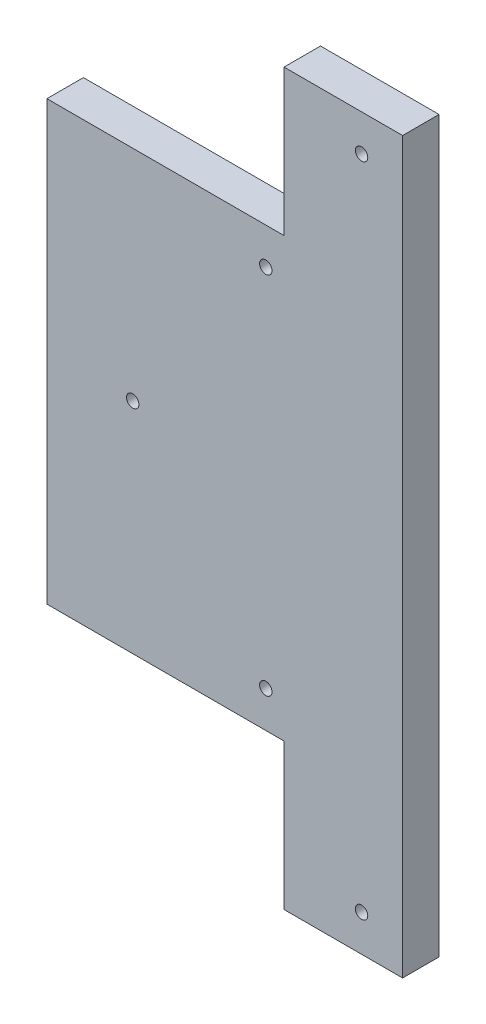
ISO-10303-21;
HEADER;
FILE_DESCRIPTION(('STEP AP214'),'2;1');
FILE_NAME('part.step','',(''),(''),'','','');
FILE_SCHEMA(('AUTOMOTIVE_DESIGN { 1 0 10303 214 1 1 1 1 }'));
ENDSEC;
DATA;
#1=APPLICATION_CONTEXT('core data for automotive mechanical design processes');
#2=APPLICATION_PROTOCOL_DEFINITION('international standard','automotive_design',2000,#1);
#3=PRODUCT_CONTEXT('',#1,'mechanical');
#4=PRODUCT('Part','Part','',(#3));
#5=PRODUCT_RELATED_PRODUCT_CATEGORY('part','',(#4));
#6=PRODUCT_DEFINITION_FORMATION('','',#4);
#7=PRODUCT_DEFINITION_CONTEXT('part definition',#1,'design');
#8=PRODUCT_DEFINITION('design','',#6,#7);
#9=PRODUCT_DEFINITION_SHAPE('','',#8);
#10=(LENGTH_UNIT() NAMED_UNIT(*) SI_UNIT(.MILLI.,.METRE.));
#11=(NAMED_UNIT(*) PLANE_ANGLE_UNIT() SI_UNIT($,.RADIAN.));
#12=(NAMED_UNIT(*) SI_UNIT($,.STERADIAN.) SOLID_ANGLE_UNIT());
#13=UNCERTAINTY_MEASURE_WITH_UNIT(LENGTH_MEASURE(1.E-05),#10,'distance_accuracy_value','');
#14=(GEOMETRIC_REPRESENTATION_CONTEXT(3) GLOBAL_UNCERTAINTY_ASSIGNED_CONTEXT((#13)) GLOBAL_UNIT_ASSIGNED_CONTEXT((#10,
#11,#12)) REPRESENTATION_CONTEXT('',''));
#15=CARTESIAN_POINT('',(0.,0.,0.));
#16=DIRECTION('',(0.,0.,1.));
#17=DIRECTION('',(1.,0.,0.));
#18=AXIS2_PLACEMENT_3D('',#15,#16,#17);
#19=CARTESIAN_POINT('',(0.,0.,10.));
#20=DIRECTION('',(0.,0.,-1.));
#21=DIRECTION('',(-1.,0.,0.));
#22=AXIS2_PLACEMENT_3D('',#19,#20,#21);
#23=PLANE('',#22);
#24=CARTESIAN_POINT('',(-62.74,0.,10.));
#25=DIRECTION('',(0.,0.,-1.));
#26=DIRECTION('',(-1.,0.,0.));
#27=AXIS2_PLACEMENT_3D('',#24,#25,#26);
#28=CIRCLE('',#27,1.7);
#29=CARTESIAN_POINT('',(-64.44,0.,10.));
#30=VERTEX_POINT('',#29);
#31=EDGE_CURVE('E277',#30,#30,#28,.T.);
#32=ORIENTED_EDGE('',*,*,#31,.T.);
#33=EDGE_LOOP('',(#32));
#34=FACE_BOUND('',#33,.T.);
#35=CARTESIAN_POINT('',(-26.25,-50.,10.));
#36=DIRECTION('',(0.,0.,-1.));
#37=DIRECTION('',(-1.,0.,0.));
#38=AXIS2_PLACEMENT_3D('',#35,#36,#37);
#39=CIRCLE('',#38,1.7);
#40=CARTESIAN_POINT('',(-27.95,-50.,10.));
#41=VERTEX_POINT('',#40);
#42=EDGE_CURVE('E188',#41,#41,#39,.T.);
#43=ORIENTED_EDGE('',*,*,#42,.T.);
#44=EDGE_LOOP('',(#43));
#45=FACE_BOUND('',#44,.T.);
#46=CARTESIAN_POINT('',(-26.25,50.,10.));
#47=DIRECTION('',(0.,0.,-1.));
#48=DIRECTION('',(-1.,0.,0.));
#49=AXIS2_PLACEMENT_3D('',#46,#47,#48);
#50=CIRCLE('',#49,1.7);
#51=CARTESIAN_POINT('',(-27.95,50.,10.));
#52=VERTEX_POINT('',#51);
#53=EDGE_CURVE('E194',#52,#52,#50,.T.);
#54=ORIENTED_EDGE('',*,*,#53,.T.);
#55=EDGE_LOOP('',(#54));
#56=FACE_BOUND('',#55,.T.);
#57=DIRECTION('',(-1.,0.,0.));
#58=VECTOR('',#57,1.);
#59=CARTESIAN_POINT('',(-21.25,-60.,10.));
#60=LINE('',#59,#58);
#61=CARTESIAN_POINT('',(-21.25,-60.,9.99999999999999));
#62=VERTEX_POINT('',#61);
#63=CARTESIAN_POINT('',(-86.25,-60.,10.));
#64=VERTEX_POINT('',#63);
#65=EDGE_CURVE('E131',#62,#64,#60,.T.);
#66=ORIENTED_EDGE('',*,*,#65,.F.);
#67=DIRECTION('',(0.,-1.,0.));
#68=VECTOR('',#67,1.);
#69=CARTESIAN_POINT('',(-21.25,-100.,10.));
#70=LINE('',#69,#68);
#71=CARTESIAN_POINT('',(-21.25,-100.,10.));
#72=VERTEX_POINT('',#71);
#73=EDGE_CURVE('E70',#62,#72,#70,.T.);
#74=ORIENTED_EDGE('',*,*,#73,.T.);
#75=DIRECTION('',(1.,0.,0.));
#76=VECTOR('',#75,1.);
#77=CARTESIAN_POINT('',(11.25,-100.,10.));
#78=LINE('',#77,#76);
#79=CARTESIAN_POINT('',(11.25,-100.,10.));
#80=VERTEX_POINT('',#79);
#81=EDGE_CURVE('E172',#72,#80,#78,.T.);
#82=ORIENTED_EDGE('',*,*,#81,.T.);
#83=DIRECTION('',(0.,1.,0.));
#84=VECTOR('',#83,1.);
#85=CARTESIAN_POINT('',(11.25,100.,10.));
#86=LINE('',#85,#84);
#87=CARTESIAN_POINT('',(11.25,100.,10.));
#88=VERTEX_POINT('',#87);
#89=EDGE_CURVE('E99',#80,#88,#86,.T.);
#90=ORIENTED_EDGE('',*,*,#89,.T.);
#91=DIRECTION('',(-1.,0.,0.));
#92=VECTOR('',#91,1.);
#93=CARTESIAN_POINT('',(11.25,100.,10.));
#94=LINE('',#93,#92);
#95=CARTESIAN_POINT('',(-21.25,100.,10.));
#96=VERTEX_POINT('',#95);
#97=EDGE_CURVE('E148',#88,#96,#94,.T.);
#98=ORIENTED_EDGE('',*,*,#97,.T.);
#99=CARTESIAN_POINT('',(-21.25,60.,9.99999999999999));
#100=VERTEX_POINT('',#99);
#101=EDGE_CURVE('E139',#96,#100,#70,.T.);
#102=ORIENTED_EDGE('',*,*,#101,.T.);
#103=DIRECTION('',(1.,0.,0.));
#104=VECTOR('',#103,1.);
#105=CARTESIAN_POINT('',(-21.25,60.,10.));
#106=LINE('',#105,#104);
#107=CARTESIAN_POINT('',(-86.25,60.,10.));
#108=VERTEX_POINT('',#107);
#109=EDGE_CURVE('E120',#108,#100,#106,.T.);
#110=ORIENTED_EDGE('',*,*,#109,.F.);
#111=DIRECTION('',(0.,1.,0.));
#112=VECTOR('',#111,1.);
#113=CARTESIAN_POINT('',(-86.25,-60.,10.));
#114=LINE('',#113,#112);
#115=EDGE_CURVE('E144',#64,#108,#114,.T.);
#116=ORIENTED_EDGE('',*,*,#115,.F.);
#117=EDGE_LOOP('',(#66,#74,#82,#90,#98,#102,#110,#116));
#118=FACE_BOUND('',#117,.T.);
#119=CARTESIAN_POINT('',(0.,-90.,10.));
#120=DIRECTION('',(0.,0.,1.));
#121=DIRECTION('',(1.,0.,0.));
#122=AXIS2_PLACEMENT_3D('',#119,#120,#121);
#123=CIRCLE('',#122,1.7);
#124=CARTESIAN_POINT('',(1.70000000000002,-90.,10.));
#125=VERTEX_POINT('',#124);
#126=EDGE_CURVE('E232',#125,#125,#123,.T.);
#127=ORIENTED_EDGE('',*,*,#126,.F.);
#128=EDGE_LOOP('',(#127));
#129=FACE_BOUND('',#128,.T.);
#130=CARTESIAN_POINT('',(0.,90.,10.));
#131=DIRECTION('',(0.,0.,1.));
#132=DIRECTION('',(1.,0.,0.));
#133=AXIS2_PLACEMENT_3D('',#130,#131,#132);
#134=CIRCLE('',#133,1.7);
#135=CARTESIAN_POINT('',(1.69999999999997,90.,10.));
#136=VERTEX_POINT('',#135);
#137=EDGE_CURVE('E165',#136,#136,#134,.T.);
#138=ORIENTED_EDGE('',*,*,#137,.F.);
#139=EDGE_LOOP('',(#138));
#140=FACE_BOUND('',#139,.T.);
#141=ADVANCED_FACE('F45',(#34,#45,#56,#118,#129,#140),#23,.F.);
#142=CARTESIAN_POINT('',(-21.25,-100.,10.));
#143=DIRECTION('',(1.,0.,0.));
#144=DIRECTION('',(0.,1.,0.));
#145=AXIS2_PLACEMENT_3D('',#142,#143,#144);
#146=PLANE('',#145);
#147=DIRECTION('',(0.,0.,-1.));
#148=VECTOR('',#147,1.);
#149=CARTESIAN_POINT('',(-21.25,60.,10.));
#150=LINE('',#149,#148);
#151=CARTESIAN_POINT('',(-21.25,60.,0.));
#152=VERTEX_POINT('',#151);
#153=EDGE_CURVE('E124',#100,#152,#150,.T.);
#154=ORIENTED_EDGE('',*,*,#153,.F.);
#155=ORIENTED_EDGE('',*,*,#101,.F.);
#156=DIRECTION('',(0.,0.,-1.));
#157=VECTOR('',#156,1.);
#158=CARTESIAN_POINT('',(-21.25,100.,10.));
#159=LINE('',#158,#157);
#160=CARTESIAN_POINT('',(-21.25,100.,0.));
#161=VERTEX_POINT('',#160);
#162=EDGE_CURVE('E155',#96,#161,#159,.T.);
#163=ORIENTED_EDGE('',*,*,#162,.T.);
#164=DIRECTION('',(0.,-1.,0.));
#165=VECTOR('',#164,1.);
#166=CARTESIAN_POINT('',(-21.25,-100.,0.));
#167=LINE('',#166,#165);
#168=EDGE_CURVE('E141',#161,#152,#167,.T.);
#169=ORIENTED_EDGE('',*,*,#168,.T.);
#170=EDGE_LOOP('',(#154,#155,#163,#169));
#171=FACE_BOUND('',#170,.T.);
#172=ADVANCED_FACE('F137',(#171),#146,.F.);
#173=CARTESIAN_POINT('',(11.25,100.,10.));
#174=DIRECTION('',(-1.,0.,0.));
#175=DIRECTION('',(0.,-1.,0.));
#176=AXIS2_PLACEMENT_3D('',#173,#174,#175);
#177=PLANE('',#176);
#178=DIRECTION('',(0.,1.,0.));
#179=VECTOR('',#178,1.);
#180=CARTESIAN_POINT('',(11.25,100.,0.));
#181=LINE('',#180,#179);
#182=CARTESIAN_POINT('',(11.25,-100.,0.));
#183=VERTEX_POINT('',#182);
#184=CARTESIAN_POINT('',(11.25,100.,0.));
#185=VERTEX_POINT('',#184);
#186=EDGE_CURVE('E160',#183,#185,#181,.T.);
#187=ORIENTED_EDGE('',*,*,#186,.T.);
#188=DIRECTION('',(0.,0.,-1.));
#189=VECTOR('',#188,1.);
#190=CARTESIAN_POINT('',(11.25,100.,10.));
#191=LINE('',#190,#189);
#192=EDGE_CURVE('E54',#88,#185,#191,.T.);
#193=ORIENTED_EDGE('',*,*,#192,.F.);
#194=ORIENTED_EDGE('',*,*,#89,.F.);
#195=DIRECTION('',(0.,0.,-1.));
#196=VECTOR('',#195,1.);
#197=CARTESIAN_POINT('',(11.25,-100.,10.));
#198=LINE('',#197,#196);
#199=EDGE_CURVE('E11',#80,#183,#198,.T.);
#200=ORIENTED_EDGE('',*,*,#199,.T.);
#201=EDGE_LOOP('',(#187,#193,#194,#200));
#202=FACE_BOUND('',#201,.T.);
#203=ADVANCED_FACE('F47',(#202),#177,.F.);
#204=CARTESIAN_POINT('',(-11.25,100.,10.));
#205=DIRECTION('',(0.,-1.,0.));
#206=DIRECTION('',(1.,0.,0.));
#207=AXIS2_PLACEMENT_3D('',#204,#205,#206);
#208=PLANE('',#207);
#209=DIRECTION('',(-1.,0.,0.));
#210=VECTOR('',#209,1.);
#211=CARTESIAN_POINT('',(-11.25,100.,0.));
#212=LINE('',#211,#210);
#213=EDGE_CURVE('E164',#185,#161,#212,.T.);
#214=ORIENTED_EDGE('',*,*,#213,.T.);
#215=ORIENTED_EDGE('',*,*,#162,.F.);
#216=ORIENTED_EDGE('',*,*,#97,.F.);
#217=ORIENTED_EDGE('',*,*,#192,.T.);
#218=EDGE_LOOP('',(#214,#215,#216,#217));
#219=FACE_BOUND('',#218,.T.);
#220=ADVANCED_FACE('F178',(#219),#208,.F.);
#221=ORIENTED_EDGE('',*,*,#73,.F.);
#222=DIRECTION('',(0.,0.,-1.));
#223=VECTOR('',#222,1.);
#224=CARTESIAN_POINT('',(-21.25,-60.,10.));
#225=LINE('',#224,#223);
#226=CARTESIAN_POINT('',(-21.25,-60.,0.));
#227=VERTEX_POINT('',#226);
#228=EDGE_CURVE('E143',#62,#227,#225,.T.);
#229=ORIENTED_EDGE('',*,*,#228,.T.);
#230=CARTESIAN_POINT('',(-21.25,-100.,0.));
#231=VERTEX_POINT('',#230);
#232=EDGE_CURVE('E92',#227,#231,#167,.T.);
#233=ORIENTED_EDGE('',*,*,#232,.T.);
#234=DIRECTION('',(0.,0.,-1.));
#235=VECTOR('',#234,1.);
#236=CARTESIAN_POINT('',(-21.25,-100.,10.));
#237=LINE('',#236,#235);
#238=EDGE_CURVE('E151',#72,#231,#237,.T.);
#239=ORIENTED_EDGE('',*,*,#238,.F.);
#240=EDGE_LOOP('',(#221,#229,#233,#239));
#241=FACE_BOUND('',#240,.T.);
#242=ADVANCED_FACE('F244',(#241),#146,.F.);
#243=CARTESIAN_POINT('',(-11.25,-100.,10.));
#244=DIRECTION('',(0.,1.,0.));
#245=DIRECTION('',(-1.,0.,0.));
#246=AXIS2_PLACEMENT_3D('',#243,#244,#245);
#247=PLANE('',#246);
#248=DIRECTION('',(1.,0.,0.));
#249=VECTOR('',#248,1.);
#250=CARTESIAN_POINT('',(-11.25,-100.,0.));
#251=LINE('',#250,#249);
#252=EDGE_CURVE('E170',#231,#183,#251,.T.);
#253=ORIENTED_EDGE('',*,*,#252,.T.);
#254=ORIENTED_EDGE('',*,*,#199,.F.);
#255=ORIENTED_EDGE('',*,*,#81,.F.);
#256=ORIENTED_EDGE('',*,*,#238,.T.);
#257=EDGE_LOOP('',(#253,#254,#255,#256));
#258=FACE_BOUND('',#257,.T.);
#259=ADVANCED_FACE('F243',(#258),#247,.F.);
#260=CARTESIAN_POINT('',(0.,0.,0.));
#261=DIRECTION('',(0.,0.,-1.));
#262=DIRECTION('',(-1.,0.,0.));
#263=AXIS2_PLACEMENT_3D('',#260,#261,#262);
#264=PLANE('',#263);
#265=CARTESIAN_POINT('',(-62.74,0.,0.));
#266=DIRECTION('',(0.,0.,-1.));
#267=DIRECTION('',(-1.,0.,0.));
#268=AXIS2_PLACEMENT_3D('',#265,#266,#267);
#269=CIRCLE('',#268,3.34999999999999);
#270=CARTESIAN_POINT('',(-66.09,0.,0.));
#271=VERTEX_POINT('',#270);
#272=EDGE_CURVE('E289',#271,#271,#269,.T.);
#273=ORIENTED_EDGE('',*,*,#272,.F.);
#274=EDGE_LOOP('',(#273));
#275=FACE_BOUND('',#274,.T.);
#276=CARTESIAN_POINT('',(-26.25,-50.,0.));
#277=DIRECTION('',(0.,0.,-1.));
#278=DIRECTION('',(-1.,0.,0.));
#279=AXIS2_PLACEMENT_3D('',#276,#277,#278);
#280=CIRCLE('',#279,3.35);
#281=CARTESIAN_POINT('',(-29.6,-50.,0.));
#282=VERTEX_POINT('',#281);
#283=EDGE_CURVE('E273',#282,#282,#280,.T.);
#284=ORIENTED_EDGE('',*,*,#283,.F.);
#285=EDGE_LOOP('',(#284));
#286=FACE_BOUND('',#285,.T.);
#287=CARTESIAN_POINT('',(-26.25,50.,0.));
#288=DIRECTION('',(0.,0.,-1.));
#289=DIRECTION('',(-1.,0.,0.));
#290=AXIS2_PLACEMENT_3D('',#287,#288,#289);
#291=CIRCLE('',#290,3.35);
#292=CARTESIAN_POINT('',(-29.6,50.,0.));
#293=VERTEX_POINT('',#292);
#294=EDGE_CURVE('E261',#293,#293,#291,.T.);
#295=ORIENTED_EDGE('',*,*,#294,.F.);
#296=EDGE_LOOP('',(#295));
#297=FACE_BOUND('',#296,.T.);
#298=CARTESIAN_POINT('',(0.,-90.,0.));
#299=DIRECTION('',(0.,0.,-1.));
#300=DIRECTION('',(-1.,0.,0.));
#301=AXIS2_PLACEMENT_3D('',#298,#299,#300);
#302=CIRCLE('',#301,3.35);
#303=CARTESIAN_POINT('',(-3.34999999999997,-90.,0.));
#304=VERTEX_POINT('',#303);
#305=EDGE_CURVE('E203',#304,#304,#302,.T.);
#306=ORIENTED_EDGE('',*,*,#305,.F.);
#307=EDGE_LOOP('',(#306));
#308=FACE_BOUND('',#307,.T.);
#309=CARTESIAN_POINT('',(0.,90.,0.));
#310=DIRECTION('',(0.,0.,-1.));
#311=DIRECTION('',(-1.,0.,0.));
#312=AXIS2_PLACEMENT_3D('',#309,#310,#311);
#313=CIRCLE('',#312,3.35);
#314=CARTESIAN_POINT('',(-3.35000000000003,90.,0.));
#315=VERTEX_POINT('',#314);
#316=EDGE_CURVE('E220',#315,#315,#313,.T.);
#317=ORIENTED_EDGE('',*,*,#316,.F.);
#318=EDGE_LOOP('',(#317));
#319=FACE_BOUND('',#318,.T.);
#320=ORIENTED_EDGE('',*,*,#186,.F.);
#321=ORIENTED_EDGE('',*,*,#252,.F.);
#322=ORIENTED_EDGE('',*,*,#232,.F.);
#323=DIRECTION('',(-1.,0.,0.));
#324=VECTOR('',#323,1.);
#325=CARTESIAN_POINT('',(-21.25,-60.,0.));
#326=LINE('',#325,#324);
#327=CARTESIAN_POINT('',(-86.25,-60.,0.));
#328=VERTEX_POINT('',#327);
#329=EDGE_CURVE('E61',#227,#328,#326,.T.);
#330=ORIENTED_EDGE('',*,*,#329,.T.);
#331=DIRECTION('',(0.,1.,0.));
#332=VECTOR('',#331,1.);
#333=CARTESIAN_POINT('',(-86.25,-60.,0.));
#334=LINE('',#333,#332);
#335=CARTESIAN_POINT('',(-86.25,60.,0.));
#336=VERTEX_POINT('',#335);
#337=EDGE_CURVE('E132',#328,#336,#334,.T.);
#338=ORIENTED_EDGE('',*,*,#337,.T.);
#339=DIRECTION('',(1.,0.,0.));
#340=VECTOR('',#339,1.);
#341=CARTESIAN_POINT('',(-21.25,60.,0.));
#342=LINE('',#341,#340);
#343=EDGE_CURVE('E185',#336,#152,#342,.T.);
#344=ORIENTED_EDGE('',*,*,#343,.T.);
#345=ORIENTED_EDGE('',*,*,#168,.F.);
#346=ORIENTED_EDGE('',*,*,#213,.F.);
#347=EDGE_LOOP('',(#320,#321,#322,#330,#338,#344,#345,#346));
#348=FACE_BOUND('',#347,.T.);
#349=ADVANCED_FACE('F183',(#275,#286,#297,#308,#319,#348),#264,.T.);
#350=CARTESIAN_POINT('',(0.,-90.,-5.));
#351=DIRECTION('',(0.,0.,1.));
#352=DIRECTION('',(1.,0.,0.));
#353=AXIS2_PLACEMENT_3D('',#350,#351,#352);
#354=CYLINDRICAL_SURFACE('',#353,1.7);
#355=ORIENTED_EDGE('',*,*,#126,.T.);
#356=EDGE_LOOP('',(#355));
#357=FACE_BOUND('',#356,.T.);
#358=CARTESIAN_POINT('',(0.,-90.,1.65));
#359=DIRECTION('',(0.,0.,-1.));
#360=DIRECTION('',(-1.,0.,0.));
#361=AXIS2_PLACEMENT_3D('',#358,#359,#360);
#362=CIRCLE('',#361,1.7);
#363=CARTESIAN_POINT('',(-1.69999999999997,-90.,1.65));
#364=VERTEX_POINT('',#363);
#365=EDGE_CURVE('E216',#364,#364,#362,.T.);
#366=ORIENTED_EDGE('',*,*,#365,.T.);
#367=EDGE_LOOP('',(#366));
#368=FACE_BOUND('',#367,.T.);
#369=ADVANCED_FACE('F298',(#357,#368),#354,.F.);
#370=CARTESIAN_POINT('',(0.,90.,-5.));
#371=DIRECTION('',(0.,0.,1.));
#372=DIRECTION('',(1.,0.,0.));
#373=AXIS2_PLACEMENT_3D('',#370,#371,#372);
#374=CYLINDRICAL_SURFACE('',#373,1.7);
#375=ORIENTED_EDGE('',*,*,#137,.T.);
#376=EDGE_LOOP('',(#375));
#377=FACE_BOUND('',#376,.T.);
#378=CARTESIAN_POINT('',(0.,90.,1.65));
#379=DIRECTION('',(0.,0.,-1.));
#380=DIRECTION('',(-1.,0.,0.));
#381=AXIS2_PLACEMENT_3D('',#378,#379,#380);
#382=CIRCLE('',#381,1.7);
#383=CARTESIAN_POINT('',(-1.70000000000003,90.,1.65));
#384=VERTEX_POINT('',#383);
#385=EDGE_CURVE('E228',#384,#384,#382,.T.);
#386=ORIENTED_EDGE('',*,*,#385,.T.);
#387=EDGE_LOOP('',(#386));
#388=FACE_BOUND('',#387,.T.);
#389=ADVANCED_FACE('F322',(#377,#388),#374,.F.);
#390=CARTESIAN_POINT('',(1.69999999999997,90.,1.65));
#391=DIRECTION('',(0.,0.,1.));
#392=DIRECTION('',(1.,0.,0.));
#393=AXIS2_PLACEMENT_3D('',#390,#391,#392);
#394=PLANE('',#393);
#395=ORIENTED_EDGE('',*,*,#385,.F.);
#396=EDGE_LOOP('',(#395));
#397=FACE_BOUND('',#396,.T.);
#398=CARTESIAN_POINT('',(0.,90.,1.65));
#399=DIRECTION('',(0.,0.,-1.));
#400=DIRECTION('',(-1.,0.,0.));
#401=AXIS2_PLACEMENT_3D('',#398,#399,#400);
#402=CIRCLE('',#401,3.35);
#403=CARTESIAN_POINT('',(-3.35000000000003,90.,1.65));
#404=VERTEX_POINT('',#403);
#405=EDGE_CURVE('E224',#404,#404,#402,.T.);
#406=ORIENTED_EDGE('',*,*,#405,.T.);
#407=EDGE_LOOP('',(#406));
#408=FACE_BOUND('',#407,.T.);
#409=ADVANCED_FACE('F311',(#397,#408),#394,.F.);
#410=CARTESIAN_POINT('',(0.,90.,0.));
#411=DIRECTION('',(0.,0.,-1.));
#412=DIRECTION('',(-1.,0.,0.));
#413=AXIS2_PLACEMENT_3D('',#410,#411,#412);
#414=CYLINDRICAL_SURFACE('',#413,3.35);
#415=ORIENTED_EDGE('',*,*,#405,.F.);
#416=EDGE_LOOP('',(#415));
#417=FACE_BOUND('',#416,.T.);
#418=ORIENTED_EDGE('',*,*,#316,.T.);
#419=EDGE_LOOP('',(#418));
#420=FACE_BOUND('',#419,.T.);
#421=ADVANCED_FACE('F308',(#417,#420),#414,.F.);
#422=CARTESIAN_POINT('',(1.70000000000002,-90.,1.65));
#423=DIRECTION('',(0.,0.,1.));
#424=DIRECTION('',(1.,0.,0.));
#425=AXIS2_PLACEMENT_3D('',#422,#423,#424);
#426=PLANE('',#425);
#427=ORIENTED_EDGE('',*,*,#365,.F.);
#428=EDGE_LOOP('',(#427));
#429=FACE_BOUND('',#428,.T.);
#430=CARTESIAN_POINT('',(0.,-90.,1.65));
#431=DIRECTION('',(0.,0.,-1.));
#432=DIRECTION('',(-1.,0.,0.));
#433=AXIS2_PLACEMENT_3D('',#430,#431,#432);
#434=CIRCLE('',#433,3.35);
#435=CARTESIAN_POINT('',(-3.34999999999997,-90.,1.65));
#436=VERTEX_POINT('',#435);
#437=EDGE_CURVE('E212',#436,#436,#434,.T.);
#438=ORIENTED_EDGE('',*,*,#437,.T.);
#439=EDGE_LOOP('',(#438));
#440=FACE_BOUND('',#439,.T.);
#441=ADVANCED_FACE('F310',(#429,#440),#426,.F.);
#442=CARTESIAN_POINT('',(0.,-90.,0.));
#443=DIRECTION('',(0.,0.,-1.));
#444=DIRECTION('',(-1.,0.,0.));
#445=AXIS2_PLACEMENT_3D('',#442,#443,#444);
#446=CYLINDRICAL_SURFACE('',#445,3.35);
#447=ORIENTED_EDGE('',*,*,#437,.F.);
#448=EDGE_LOOP('',(#447));
#449=FACE_BOUND('',#448,.T.);
#450=ORIENTED_EDGE('',*,*,#305,.T.);
#451=EDGE_LOOP('',(#450));
#452=FACE_BOUND('',#451,.T.);
#453=ADVANCED_FACE('F319',(#449,#452),#446,.F.);
#454=CARTESIAN_POINT('',(-21.25,60.,10.));
#455=DIRECTION('',(0.,1.,0.));
#456=DIRECTION('',(-1.,0.,0.));
#457=AXIS2_PLACEMENT_3D('',#454,#455,#456);
#458=PLANE('',#457);
#459=ORIENTED_EDGE('',*,*,#109,.T.);
#460=ORIENTED_EDGE('',*,*,#153,.T.);
#461=ORIENTED_EDGE('',*,*,#343,.F.);
#462=DIRECTION('',(0.,0.,-1.));
#463=VECTOR('',#462,1.);
#464=CARTESIAN_POINT('',(-86.25,60.,10.));
#465=LINE('',#464,#463);
#466=EDGE_CURVE('E126',#108,#336,#465,.T.);
#467=ORIENTED_EDGE('',*,*,#466,.F.);
#468=EDGE_LOOP('',(#459,#460,#461,#467));
#469=FACE_BOUND('',#468,.T.);
#470=ADVANCED_FACE('F122',(#469),#458,.T.);
#471=CARTESIAN_POINT('',(-86.25,-60.,10.));
#472=DIRECTION('',(-1.,0.,0.));
#473=DIRECTION('',(0.,0.,1.));
#474=AXIS2_PLACEMENT_3D('',#471,#472,#473);
#475=PLANE('',#474);
#476=ORIENTED_EDGE('',*,*,#337,.F.);
#477=DIRECTION('',(0.,0.,-1.));
#478=VECTOR('',#477,1.);
#479=CARTESIAN_POINT('',(-86.25,-60.,10.));
#480=LINE('',#479,#478);
#481=EDGE_CURVE('E204',#64,#328,#480,.T.);
#482=ORIENTED_EDGE('',*,*,#481,.F.);
#483=ORIENTED_EDGE('',*,*,#115,.T.);
#484=ORIENTED_EDGE('',*,*,#466,.T.);
#485=EDGE_LOOP('',(#476,#482,#483,#484));
#486=FACE_BOUND('',#485,.T.);
#487=ADVANCED_FACE('F430',(#486),#475,.T.);
#488=CARTESIAN_POINT('',(-21.25,-60.,10.));
#489=DIRECTION('',(0.,-1.,0.));
#490=DIRECTION('',(1.,0.,0.));
#491=AXIS2_PLACEMENT_3D('',#488,#489,#490);
#492=PLANE('',#491);
#493=ORIENTED_EDGE('',*,*,#228,.F.);
#494=ORIENTED_EDGE('',*,*,#65,.T.);
#495=ORIENTED_EDGE('',*,*,#481,.T.);
#496=ORIENTED_EDGE('',*,*,#329,.F.);
#497=EDGE_LOOP('',(#493,#494,#495,#496));
#498=FACE_BOUND('',#497,.T.);
#499=ADVANCED_FACE('F433',(#498),#492,.T.);
#500=CARTESIAN_POINT('',(-26.25,50.,15.));
#501=DIRECTION('',(0.,0.,-1.));
#502=DIRECTION('',(-1.,0.,0.));
#503=AXIS2_PLACEMENT_3D('',#500,#501,#502);
#504=CYLINDRICAL_SURFACE('',#503,1.7);
#505=ORIENTED_EDGE('',*,*,#53,.F.);
#506=EDGE_LOOP('',(#505));
#507=FACE_BOUND('',#506,.T.);
#508=CARTESIAN_POINT('',(-26.25,50.,1.65));
#509=DIRECTION('',(0.,0.,-1.));
#510=DIRECTION('',(-1.,0.,0.));
#511=AXIS2_PLACEMENT_3D('',#508,#509,#510);
#512=CIRCLE('',#511,1.7);
#513=CARTESIAN_POINT('',(-27.95,50.,1.65));
#514=VERTEX_POINT('',#513);
#515=EDGE_CURVE('E253',#514,#514,#512,.T.);
#516=ORIENTED_EDGE('',*,*,#515,.T.);
#517=EDGE_LOOP('',(#516));
#518=FACE_BOUND('',#517,.T.);
#519=ADVANCED_FACE('F450',(#507,#518),#504,.F.);
#520=CARTESIAN_POINT('',(-26.25,-50.,15.));
#521=DIRECTION('',(0.,0.,-1.));
#522=DIRECTION('',(-1.,0.,0.));
#523=AXIS2_PLACEMENT_3D('',#520,#521,#522);
#524=CYLINDRICAL_SURFACE('',#523,1.7);
#525=ORIENTED_EDGE('',*,*,#42,.F.);
#526=EDGE_LOOP('',(#525));
#527=FACE_BOUND('',#526,.T.);
#528=CARTESIAN_POINT('',(-26.25,-50.,1.65));
#529=DIRECTION('',(0.,0.,-1.));
#530=DIRECTION('',(-1.,0.,0.));
#531=AXIS2_PLACEMENT_3D('',#528,#529,#530);
#532=CIRCLE('',#531,1.7);
#533=CARTESIAN_POINT('',(-27.95,-50.,1.65));
#534=VERTEX_POINT('',#533);
#535=EDGE_CURVE('E265',#534,#534,#532,.T.);
#536=ORIENTED_EDGE('',*,*,#535,.T.);
#537=EDGE_LOOP('',(#536));
#538=FACE_BOUND('',#537,.T.);
#539=ADVANCED_FACE('F481',(#527,#538),#524,.F.);
#540=CARTESIAN_POINT('',(-24.55,50.,1.65));
#541=DIRECTION('',(0.,0.,1.));
#542=DIRECTION('',(1.,0.,0.));
#543=AXIS2_PLACEMENT_3D('',#540,#541,#542);
#544=PLANE('',#543);
#545=ORIENTED_EDGE('',*,*,#515,.F.);
#546=EDGE_LOOP('',(#545));
#547=FACE_BOUND('',#546,.T.);
#548=CARTESIAN_POINT('',(-26.25,50.,1.65));
#549=DIRECTION('',(0.,0.,-1.));
#550=DIRECTION('',(-1.,0.,0.));
#551=AXIS2_PLACEMENT_3D('',#548,#549,#550);
#552=CIRCLE('',#551,3.35);
#553=CARTESIAN_POINT('',(-29.6,50.,1.65));
#554=VERTEX_POINT('',#553);
#555=EDGE_CURVE('E257',#554,#554,#552,.T.);
#556=ORIENTED_EDGE('',*,*,#555,.T.);
#557=EDGE_LOOP('',(#556));
#558=FACE_BOUND('',#557,.T.);
#559=ADVANCED_FACE('F491',(#547,#558),#544,.F.);
#560=CARTESIAN_POINT('',(-26.25,50.,0.));
#561=DIRECTION('',(0.,0.,-1.));
#562=DIRECTION('',(-1.,0.,0.));
#563=AXIS2_PLACEMENT_3D('',#560,#561,#562);
#564=CYLINDRICAL_SURFACE('',#563,3.35);
#565=ORIENTED_EDGE('',*,*,#555,.F.);
#566=EDGE_LOOP('',(#565));
#567=FACE_BOUND('',#566,.T.);
#568=ORIENTED_EDGE('',*,*,#294,.T.);
#569=EDGE_LOOP('',(#568));
#570=FACE_BOUND('',#569,.T.);
#571=ADVANCED_FACE('F501',(#567,#570),#564,.F.);
#572=CARTESIAN_POINT('',(-24.55,-50.,1.65));
#573=DIRECTION('',(0.,0.,1.));
#574=DIRECTION('',(1.,0.,0.));
#575=AXIS2_PLACEMENT_3D('',#572,#573,#574);
#576=PLANE('',#575);
#577=ORIENTED_EDGE('',*,*,#535,.F.);
#578=EDGE_LOOP('',(#577));
#579=FACE_BOUND('',#578,.T.);
#580=CARTESIAN_POINT('',(-26.25,-50.,1.65));
#581=DIRECTION('',(0.,0.,-1.));
#582=DIRECTION('',(-1.,0.,0.));
#583=AXIS2_PLACEMENT_3D('',#580,#581,#582);
#584=CIRCLE('',#583,3.35);
#585=CARTESIAN_POINT('',(-29.6,-50.,1.65));
#586=VERTEX_POINT('',#585);
#587=EDGE_CURVE('E269',#586,#586,#584,.T.);
#588=ORIENTED_EDGE('',*,*,#587,.T.);
#589=EDGE_LOOP('',(#588));
#590=FACE_BOUND('',#589,.T.);
#591=ADVANCED_FACE('F511',(#579,#590),#576,.F.);
#592=CARTESIAN_POINT('',(-26.25,-50.,0.));
#593=DIRECTION('',(0.,0.,-1.));
#594=DIRECTION('',(-1.,0.,0.));
#595=AXIS2_PLACEMENT_3D('',#592,#593,#594);
#596=CYLINDRICAL_SURFACE('',#595,3.35);
#597=ORIENTED_EDGE('',*,*,#587,.F.);
#598=EDGE_LOOP('',(#597));
#599=FACE_BOUND('',#598,.T.);
#600=ORIENTED_EDGE('',*,*,#283,.T.);
#601=EDGE_LOOP('',(#600));
#602=FACE_BOUND('',#601,.T.);
#603=ADVANCED_FACE('F521',(#599,#602),#596,.F.);
#604=CARTESIAN_POINT('',(-62.74,0.,10.));
#605=DIRECTION('',(0.,0.,-1.));
#606=DIRECTION('',(-1.,0.,0.));
#607=AXIS2_PLACEMENT_3D('',#604,#605,#606);
#608=CYLINDRICAL_SURFACE('',#607,1.7);
#609=ORIENTED_EDGE('',*,*,#31,.F.);
#610=EDGE_LOOP('',(#609));
#611=FACE_BOUND('',#610,.T.);
#612=CARTESIAN_POINT('',(-62.74,0.,1.65));
#613=DIRECTION('',(0.,0.,-1.));
#614=DIRECTION('',(-1.,0.,0.));
#615=AXIS2_PLACEMENT_3D('',#612,#613,#614);
#616=CIRCLE('',#615,1.7);
#617=CARTESIAN_POINT('',(-64.44,0.,1.65));
#618=VERTEX_POINT('',#617);
#619=EDGE_CURVE('E281',#618,#618,#616,.T.);
#620=ORIENTED_EDGE('',*,*,#619,.T.);
#621=EDGE_LOOP('',(#620));
#622=FACE_BOUND('',#621,.T.);
#623=ADVANCED_FACE('F530',(#611,#622),#608,.F.);
#624=CARTESIAN_POINT('',(-61.04,0.,1.65));
#625=DIRECTION('',(0.,0.,1.));
#626=DIRECTION('',(1.,0.,0.));
#627=AXIS2_PLACEMENT_3D('',#624,#625,#626);
#628=PLANE('',#627);
#629=ORIENTED_EDGE('',*,*,#619,.F.);
#630=EDGE_LOOP('',(#629));
#631=FACE_BOUND('',#630,.T.);
#632=CARTESIAN_POINT('',(-62.74,0.,1.65));
#633=DIRECTION('',(0.,0.,-1.));
#634=DIRECTION('',(-1.,0.,0.));
#635=AXIS2_PLACEMENT_3D('',#632,#633,#634);
#636=CIRCLE('',#635,3.35);
#637=CARTESIAN_POINT('',(-66.09,0.,1.65));
#638=VERTEX_POINT('',#637);
#639=EDGE_CURVE('E285',#638,#638,#636,.T.);
#640=ORIENTED_EDGE('',*,*,#639,.T.);
#641=EDGE_LOOP('',(#640));
#642=FACE_BOUND('',#641,.T.);
#643=ADVANCED_FACE('F540',(#631,#642),#628,.F.);
#644=CARTESIAN_POINT('',(-62.74,0.,0.));
#645=DIRECTION('',(0.,0.,-1.));
#646=DIRECTION('',(-1.,0.,0.));
#647=AXIS2_PLACEMENT_3D('',#644,#645,#646);
#648=CYLINDRICAL_SURFACE('',#647,3.35);
#649=ORIENTED_EDGE('',*,*,#639,.F.);
#650=EDGE_LOOP('',(#649));
#651=FACE_BOUND('',#650,.T.);
#652=ORIENTED_EDGE('',*,*,#272,.T.);
#653=EDGE_LOOP('',(#652));
#654=FACE_BOUND('',#653,.T.);
#655=ADVANCED_FACE('F294',(#651,#654),#648,.F.);
#656=CLOSED_SHELL('',(#141,#172,#203,#220,#242,#259,#349,#369,#389,#409,#421,#441,#453,#470,
#487,#499,#519,#539,#559,#571,#591,#603,#623,#643,#655));
#657=MANIFOLD_SOLID_BREP('B2',#656);
#658=ADVANCED_BREP_SHAPE_REPRESENTATION('',(#18,#657),#14);
#659=SHAPE_DEFINITION_REPRESENTATION(#9,#658);
ENDSEC;
END-ISO-10303-21;
